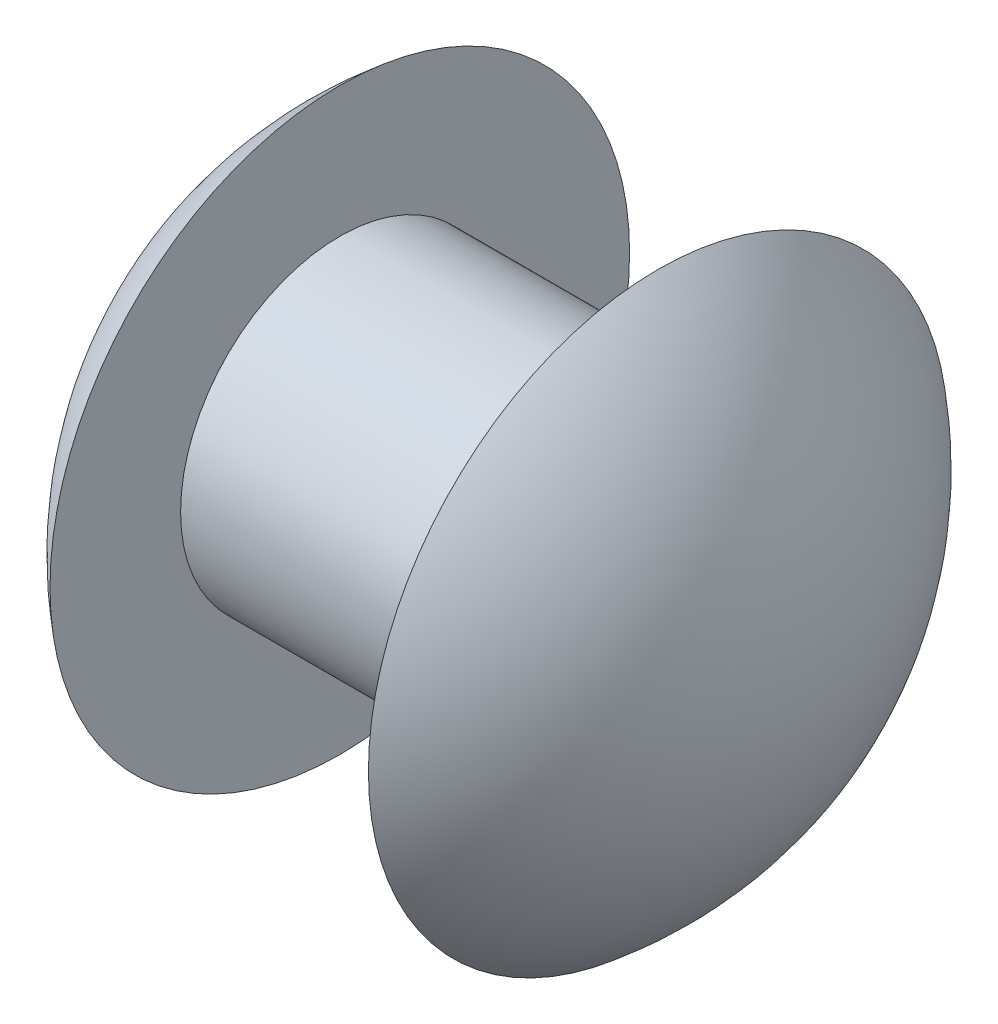
ISO-10303-21;
HEADER;
FILE_DESCRIPTION(('STEP AP214'),'2;1');
FILE_NAME('part.step','',(''),(''),'','','');
FILE_SCHEMA(('AUTOMOTIVE_DESIGN { 1 0 10303 214 1 1 1 1 }'));
ENDSEC;
DATA;
#1=APPLICATION_CONTEXT('core data for automotive mechanical design processes');
#2=APPLICATION_PROTOCOL_DEFINITION('international standard','automotive_design',2000,#1);
#3=PRODUCT_CONTEXT('',#1,'mechanical');
#4=PRODUCT('Part','Part','',(#3));
#5=PRODUCT_RELATED_PRODUCT_CATEGORY('part','',(#4));
#6=PRODUCT_DEFINITION_FORMATION('','',#4);
#7=PRODUCT_DEFINITION_CONTEXT('part definition',#1,'design');
#8=PRODUCT_DEFINITION('design','',#6,#7);
#9=PRODUCT_DEFINITION_SHAPE('','',#8);
#10=(LENGTH_UNIT() NAMED_UNIT(*) SI_UNIT(.MILLI.,.METRE.));
#11=(NAMED_UNIT(*) PLANE_ANGLE_UNIT() SI_UNIT($,.RADIAN.));
#12=(NAMED_UNIT(*) SI_UNIT($,.STERADIAN.) SOLID_ANGLE_UNIT());
#13=UNCERTAINTY_MEASURE_WITH_UNIT(LENGTH_MEASURE(1.E-05),#10,'distance_accuracy_value','');
#14=(GEOMETRIC_REPRESENTATION_CONTEXT(3) GLOBAL_UNCERTAINTY_ASSIGNED_CONTEXT((#13)) GLOBAL_UNIT_ASSIGNED_CONTEXT((#10,
#11,#12)) REPRESENTATION_CONTEXT('',''));
#15=CARTESIAN_POINT('',(0.,0.,0.));
#16=DIRECTION('',(0.,0.,1.));
#17=DIRECTION('',(1.,0.,0.));
#18=AXIS2_PLACEMENT_3D('',#15,#16,#17);
#19=CARTESIAN_POINT('',(-49.4235173824131,0.,0.));
#20=DIRECTION('',(-1.,0.,0.));
#21=DIRECTION('',(0.,0.,1.));
#22=AXIS2_PLACEMENT_3D('',#19,#20,#21);
#23=CYLINDRICAL_SURFACE('',#22,1.5);
#24=CARTESIAN_POINT('',(-0.017667154522609,0.,0.));
#25=DIRECTION('',(-1.,0.,0.));
#26=DIRECTION('',(0.,0.,1.));
#27=AXIS2_PLACEMENT_3D('',#24,#25,#26);
#28=CIRCLE('',#27,1.5);
#29=CARTESIAN_POINT('',(-0.017667154522609,0.,1.5));
#30=VERTEX_POINT('',#29);
#31=EDGE_CURVE('E41',#30,#30,#28,.T.);
#32=ORIENTED_EDGE('',*,*,#31,.F.);
#33=EDGE_LOOP('',(#32));
#34=FACE_BOUND('',#33,.T.);
#35=CARTESIAN_POINT('',(2.98233284547739,0.,0.));
#36=DIRECTION('',(-1.,0.,0.));
#37=DIRECTION('',(0.,0.,1.));
#38=AXIS2_PLACEMENT_3D('',#35,#36,#37);
#39=CIRCLE('',#38,1.5);
#40=CARTESIAN_POINT('',(2.98233284547739,0.,1.5));
#41=VERTEX_POINT('',#40);
#42=EDGE_CURVE('E10',#41,#41,#39,.T.);
#43=ORIENTED_EDGE('',*,*,#42,.T.);
#44=EDGE_LOOP('',(#43));
#45=FACE_BOUND('',#44,.T.);
#46=ADVANCED_FACE('F27',(#34,#45),#23,.T.);
#47=CARTESIAN_POINT('',(2.98233284547739,1.5,0.));
#48=DIRECTION('',(1.,0.,0.));
#49=DIRECTION('',(0.,0.,-1.));
#50=AXIS2_PLACEMENT_3D('',#47,#48,#49);
#51=PLANE('',#50);
#52=ORIENTED_EDGE('',*,*,#42,.F.);
#53=EDGE_LOOP('',(#52));
#54=FACE_BOUND('',#53,.T.);
#55=CARTESIAN_POINT('',(2.98233284547739,0.,0.));
#56=DIRECTION('',(-1.,0.,0.));
#57=DIRECTION('',(0.,0.,1.));
#58=AXIS2_PLACEMENT_3D('',#55,#56,#57);
#59=CIRCLE('',#58,2.730271716566);
#60=CARTESIAN_POINT('',(2.98233284547739,0.,2.730271716566));
#61=VERTEX_POINT('',#60);
#62=EDGE_CURVE('E33',#61,#61,#59,.T.);
#63=ORIENTED_EDGE('',*,*,#62,.T.);
#64=EDGE_LOOP('',(#63));
#65=FACE_BOUND('',#64,.T.);
#66=ADVANCED_FACE('F50',(#54,#65),#51,.F.);
#67=CARTESIAN_POINT('',(0.792443269786479,0.,0.));
#68=DIRECTION('',(-1.,0.,0.));
#69=DIRECTION('',(0.,1.,0.));
#70=AXIS2_PLACEMENT_3D('',#67,#68,#69);
#71=SPHERICAL_SURFACE('',#70,3.5);
#72=ORIENTED_EDGE('',*,*,#62,.F.);
#73=EDGE_LOOP('',(#72));
#74=FACE_BOUND('',#73,.T.);
#75=ADVANCED_FACE('F54',(#74),#71,.T.);
#76=CARTESIAN_POINT('',(2.17222242116831,0.,0.));
#77=DIRECTION('',(-1.,0.,0.));
#78=DIRECTION('',(0.,1.,0.));
#79=AXIS2_PLACEMENT_3D('',#76,#77,#78);
#80=SPHERICAL_SURFACE('',#79,3.5);
#81=CARTESIAN_POINT('',(-0.017667154522602,0.,0.));
#82=DIRECTION('',(-1.,0.,0.));
#83=DIRECTION('',(0.,0.,1.));
#84=AXIS2_PLACEMENT_3D('',#81,#82,#83);
#85=CIRCLE('',#84,2.730271716566);
#86=CARTESIAN_POINT('',(-0.017667154522602,0.,2.730271716566));
#87=VERTEX_POINT('',#86);
#88=EDGE_CURVE('E37',#87,#87,#85,.T.);
#89=ORIENTED_EDGE('',*,*,#88,.T.);
#90=EDGE_LOOP('',(#89));
#91=FACE_BOUND('',#90,.T.);
#92=ADVANCED_FACE('F59',(#91),#80,.T.);
#93=CARTESIAN_POINT('',(-0.0176671545226057,1.5,0.));
#94=DIRECTION('',(-1.,0.,0.));
#95=DIRECTION('',(0.,0.,1.));
#96=AXIS2_PLACEMENT_3D('',#93,#94,#95);
#97=PLANE('',#96);
#98=ORIENTED_EDGE('',*,*,#88,.F.);
#99=EDGE_LOOP('',(#98));
#100=FACE_BOUND('',#99,.T.);
#101=ORIENTED_EDGE('',*,*,#31,.T.);
#102=EDGE_LOOP('',(#101));
#103=FACE_BOUND('',#102,.T.);
#104=ADVANCED_FACE('F47',(#100,#103),#97,.F.);
#105=CLOSED_SHELL('',(#46,#66,#75,#92,#104));
#106=MANIFOLD_SOLID_BREP('B2',#105);
#107=ADVANCED_BREP_SHAPE_REPRESENTATION('',(#18,#106),#14);
#108=SHAPE_DEFINITION_REPRESENTATION(#9,#107);
ENDSEC;
END-ISO-10303-21;
